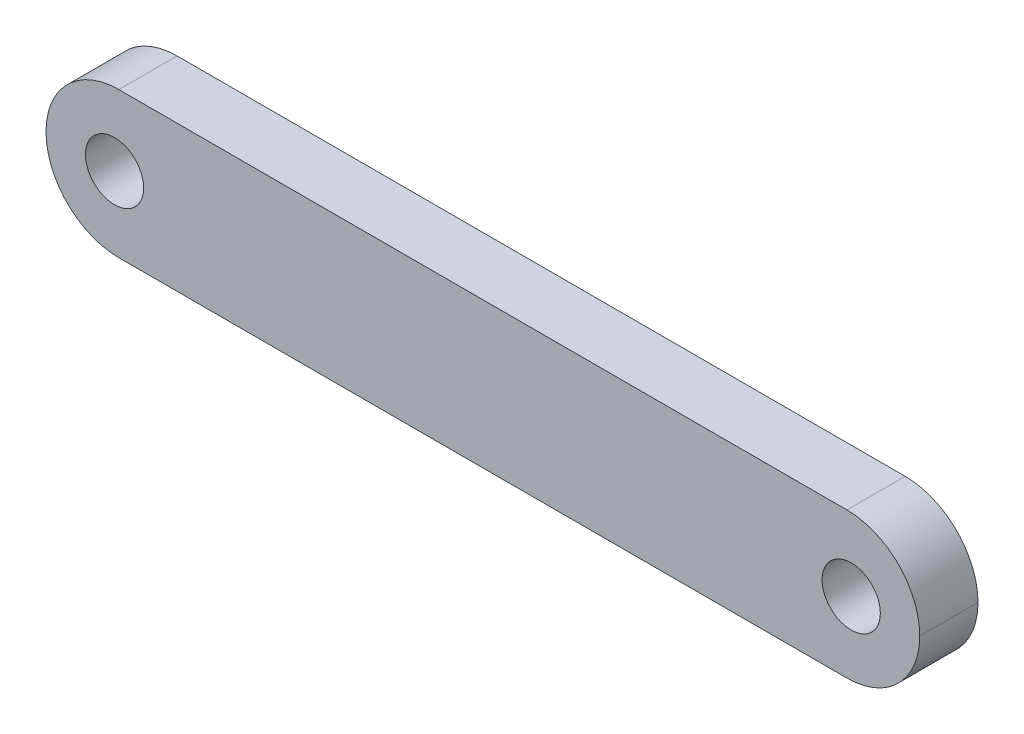
ISO-10303-21;
HEADER;
FILE_DESCRIPTION(('STEP AP214'),'2;1');
FILE_NAME('part.step','',(''),(''),'','','');
FILE_SCHEMA(('AUTOMOTIVE_DESIGN { 1 0 10303 214 1 1 1 1 }'));
ENDSEC;
DATA;
#1=APPLICATION_CONTEXT('core data for automotive mechanical design processes');
#2=APPLICATION_PROTOCOL_DEFINITION('international standard','automotive_design',2000,#1);
#3=PRODUCT_CONTEXT('',#1,'mechanical');
#4=PRODUCT('Part','Part','',(#3));
#5=PRODUCT_RELATED_PRODUCT_CATEGORY('part','',(#4));
#6=PRODUCT_DEFINITION_FORMATION('','',#4);
#7=PRODUCT_DEFINITION_CONTEXT('part definition',#1,'design');
#8=PRODUCT_DEFINITION('design','',#6,#7);
#9=PRODUCT_DEFINITION_SHAPE('','',#8);
#10=(LENGTH_UNIT() NAMED_UNIT(*) SI_UNIT(.MILLI.,.METRE.));
#11=(NAMED_UNIT(*) PLANE_ANGLE_UNIT() SI_UNIT($,.RADIAN.));
#12=(NAMED_UNIT(*) SI_UNIT($,.STERADIAN.) SOLID_ANGLE_UNIT());
#13=UNCERTAINTY_MEASURE_WITH_UNIT(LENGTH_MEASURE(1.E-05),#10,'distance_accuracy_value','');
#14=(GEOMETRIC_REPRESENTATION_CONTEXT(3) GLOBAL_UNCERTAINTY_ASSIGNED_CONTEXT((#13)) GLOBAL_UNIT_ASSIGNED_CONTEXT((#10,
#11,#12)) REPRESENTATION_CONTEXT('',''));
#15=CARTESIAN_POINT('',(0.,0.,0.));
#16=DIRECTION('',(0.,0.,1.));
#17=DIRECTION('',(1.,0.,0.));
#18=AXIS2_PLACEMENT_3D('',#15,#16,#17);
#19=CARTESIAN_POINT('',(0.,0.,2.));
#20=DIRECTION('',(0.,0.,1.));
#21=DIRECTION('',(1.,0.,0.));
#22=AXIS2_PLACEMENT_3D('',#19,#20,#21);
#23=PLANE('',#22);
#24=CARTESIAN_POINT('',(12.6461263558895,0.,2.));
#25=DIRECTION('',(0.,0.,1.));
#26=DIRECTION('',(1.,0.,0.));
#27=AXIS2_PLACEMENT_3D('',#24,#25,#26);
#28=CIRCLE('',#27,1.);
#29=CARTESIAN_POINT('',(13.6461263558895,0.,2.));
#30=VERTEX_POINT('',#29);
#31=EDGE_CURVE('E126',#30,#30,#28,.T.);
#32=ORIENTED_EDGE('',*,*,#31,.F.);
#33=EDGE_LOOP('',(#32));
#34=FACE_BOUND('',#33,.T.);
#35=CARTESIAN_POINT('',(-12.5,0.,2.));
#36=DIRECTION('',(0.,0.,1.));
#37=DIRECTION('',(1.,0.,0.));
#38=AXIS2_PLACEMENT_3D('',#35,#36,#37);
#39=CIRCLE('',#38,2.5);
#40=CARTESIAN_POINT('',(-12.5,2.5,2.));
#41=VERTEX_POINT('',#40);
#42=CARTESIAN_POINT('',(-15.,0.,2.));
#43=VERTEX_POINT('',#42);
#44=EDGE_CURVE('E56',#41,#43,#39,.T.);
#45=ORIENTED_EDGE('',*,*,#44,.T.);
#46=CARTESIAN_POINT('',(-12.5,0.,2.));
#47=DIRECTION('',(0.,0.,1.));
#48=DIRECTION('',(1.,0.,0.));
#49=AXIS2_PLACEMENT_3D('',#46,#47,#48);
#50=CIRCLE('',#49,2.5);
#51=CARTESIAN_POINT('',(-12.5,-2.5,2.));
#52=VERTEX_POINT('',#51);
#53=EDGE_CURVE('E138',#43,#52,#50,.T.);
#54=ORIENTED_EDGE('',*,*,#53,.T.);
#55=DIRECTION('',(1.,0.,0.));
#56=VECTOR('',#55,1.);
#57=CARTESIAN_POINT('',(-15.,-2.5,2.));
#58=LINE('',#57,#56);
#59=CARTESIAN_POINT('',(12.5,-2.5,2.));
#60=VERTEX_POINT('',#59);
#61=EDGE_CURVE('E114',#52,#60,#58,.T.);
#62=ORIENTED_EDGE('',*,*,#61,.T.);
#63=CARTESIAN_POINT('',(12.5,0.,2.));
#64=DIRECTION('',(0.,0.,1.));
#65=DIRECTION('',(1.,0.,0.));
#66=AXIS2_PLACEMENT_3D('',#63,#64,#65);
#67=CIRCLE('',#66,2.5);
#68=CARTESIAN_POINT('',(15.,0.,2.));
#69=VERTEX_POINT('',#68);
#70=EDGE_CURVE('E135',#60,#69,#67,.T.);
#71=ORIENTED_EDGE('',*,*,#70,.T.);
#72=CARTESIAN_POINT('',(12.5,0.,2.));
#73=DIRECTION('',(0.,0.,1.));
#74=DIRECTION('',(1.,0.,0.));
#75=AXIS2_PLACEMENT_3D('',#72,#73,#74);
#76=CIRCLE('',#75,2.5);
#77=CARTESIAN_POINT('',(12.5,2.5,2.));
#78=VERTEX_POINT('',#77);
#79=EDGE_CURVE('E103',#69,#78,#76,.T.);
#80=ORIENTED_EDGE('',*,*,#79,.T.);
#81=DIRECTION('',(-1.,0.,0.));
#82=VECTOR('',#81,1.);
#83=CARTESIAN_POINT('',(-15.,2.5,2.));
#84=LINE('',#83,#82);
#85=EDGE_CURVE('E122',#78,#41,#84,.T.);
#86=ORIENTED_EDGE('',*,*,#85,.T.);
#87=EDGE_LOOP('',(#45,#54,#62,#71,#80,#86));
#88=FACE_BOUND('',#87,.T.);
#89=CARTESIAN_POINT('',(-12.6461263558895,0.,2.));
#90=DIRECTION('',(0.,0.,1.));
#91=DIRECTION('',(-1.,0.,0.));
#92=AXIS2_PLACEMENT_3D('',#89,#90,#91);
#93=CIRCLE('',#92,1.);
#94=CARTESIAN_POINT('',(-13.6461263558895,0.,2.));
#95=VERTEX_POINT('',#94);
#96=EDGE_CURVE('E142',#95,#95,#93,.T.);
#97=ORIENTED_EDGE('',*,*,#96,.F.);
#98=EDGE_LOOP('',(#97));
#99=FACE_BOUND('',#98,.T.);
#100=ADVANCED_FACE('F39',(#34,#88,#99),#23,.T.);
#101=CARTESIAN_POINT('',(0.,0.,0.));
#102=DIRECTION('',(0.,0.,1.));
#103=DIRECTION('',(1.,0.,0.));
#104=AXIS2_PLACEMENT_3D('',#101,#102,#103);
#105=PLANE('',#104);
#106=DIRECTION('',(1.,0.,0.));
#107=VECTOR('',#106,1.);
#108=CARTESIAN_POINT('',(-15.,-2.5,0.));
#109=LINE('',#108,#107);
#110=CARTESIAN_POINT('',(-12.5,-2.5,0.));
#111=VERTEX_POINT('',#110);
#112=CARTESIAN_POINT('',(12.5,-2.5,0.));
#113=VERTEX_POINT('',#112);
#114=EDGE_CURVE('E111',#111,#113,#109,.T.);
#115=ORIENTED_EDGE('',*,*,#114,.F.);
#116=CARTESIAN_POINT('',(-12.5,0.,0.));
#117=DIRECTION('',(0.,0.,1.));
#118=DIRECTION('',(1.,0.,0.));
#119=AXIS2_PLACEMENT_3D('',#116,#117,#118);
#120=CIRCLE('',#119,2.5);
#121=CARTESIAN_POINT('',(-15.,0.,0.));
#122=VERTEX_POINT('',#121);
#123=EDGE_CURVE('E94',#111,#122,#120,.F.);
#124=ORIENTED_EDGE('',*,*,#123,.T.);
#125=CARTESIAN_POINT('',(-12.5,0.,0.));
#126=DIRECTION('',(0.,0.,1.));
#127=DIRECTION('',(1.,0.,0.));
#128=AXIS2_PLACEMENT_3D('',#125,#126,#127);
#129=CIRCLE('',#128,2.5);
#130=CARTESIAN_POINT('',(-12.5,2.5,0.));
#131=VERTEX_POINT('',#130);
#132=EDGE_CURVE('E104',#122,#131,#129,.F.);
#133=ORIENTED_EDGE('',*,*,#132,.T.);
#134=DIRECTION('',(-1.,0.,0.));
#135=VECTOR('',#134,1.);
#136=CARTESIAN_POINT('',(-15.,2.5,0.));
#137=LINE('',#136,#135);
#138=CARTESIAN_POINT('',(12.5,2.5,0.));
#139=VERTEX_POINT('',#138);
#140=EDGE_CURVE('E123',#139,#131,#137,.T.);
#141=ORIENTED_EDGE('',*,*,#140,.F.);
#142=CARTESIAN_POINT('',(12.5,0.,0.));
#143=DIRECTION('',(0.,0.,1.));
#144=DIRECTION('',(1.,0.,0.));
#145=AXIS2_PLACEMENT_3D('',#142,#143,#144);
#146=CIRCLE('',#145,2.5);
#147=CARTESIAN_POINT('',(15.,0.,0.));
#148=VERTEX_POINT('',#147);
#149=EDGE_CURVE('E115',#139,#148,#146,.F.);
#150=ORIENTED_EDGE('',*,*,#149,.T.);
#151=CARTESIAN_POINT('',(12.5,0.,0.));
#152=DIRECTION('',(0.,0.,1.));
#153=DIRECTION('',(1.,0.,0.));
#154=AXIS2_PLACEMENT_3D('',#151,#152,#153);
#155=CIRCLE('',#154,2.5);
#156=EDGE_CURVE('E121',#148,#113,#155,.F.);
#157=ORIENTED_EDGE('',*,*,#156,.T.);
#158=EDGE_LOOP('',(#115,#124,#133,#141,#150,#157));
#159=FACE_BOUND('',#158,.T.);
#160=CARTESIAN_POINT('',(12.6461263558895,0.,0.));
#161=DIRECTION('',(0.,0.,1.));
#162=DIRECTION('',(1.,0.,0.));
#163=AXIS2_PLACEMENT_3D('',#160,#161,#162);
#164=CIRCLE('',#163,1.);
#165=CARTESIAN_POINT('',(13.6461263558895,0.,0.));
#166=VERTEX_POINT('',#165);
#167=EDGE_CURVE('E158',#166,#166,#164,.T.);
#168=ORIENTED_EDGE('',*,*,#167,.T.);
#169=EDGE_LOOP('',(#168));
#170=FACE_BOUND('',#169,.T.);
#171=CARTESIAN_POINT('',(-12.6461263558895,0.,0.));
#172=DIRECTION('',(0.,0.,1.));
#173=DIRECTION('',(-1.,0.,0.));
#174=AXIS2_PLACEMENT_3D('',#171,#172,#173);
#175=CIRCLE('',#174,1.);
#176=CARTESIAN_POINT('',(-13.6461263558895,0.,0.));
#177=VERTEX_POINT('',#176);
#178=EDGE_CURVE('E140',#177,#177,#175,.T.);
#179=ORIENTED_EDGE('',*,*,#178,.T.);
#180=EDGE_LOOP('',(#179));
#181=FACE_BOUND('',#180,.T.);
#182=ADVANCED_FACE('F118',(#159,#170,#181),#105,.F.);
#183=CARTESIAN_POINT('',(-15.,2.5,2.));
#184=DIRECTION('',(0.,-1.,0.));
#185=DIRECTION('',(0.,0.,-1.));
#186=AXIS2_PLACEMENT_3D('',#183,#184,#185);
#187=PLANE('',#186);
#188=ORIENTED_EDGE('',*,*,#140,.T.);
#189=DIRECTION('',(0.,0.,-1.));
#190=VECTOR('',#189,1.);
#191=CARTESIAN_POINT('',(-12.5,2.5,2.));
#192=LINE('',#191,#190);
#193=EDGE_CURVE('E11',#131,#41,#192,.F.);
#194=ORIENTED_EDGE('',*,*,#193,.T.);
#195=ORIENTED_EDGE('',*,*,#85,.F.);
#196=DIRECTION('',(0.,0.,-1.));
#197=VECTOR('',#196,1.);
#198=CARTESIAN_POINT('',(12.5,2.5,2.));
#199=LINE('',#198,#197);
#200=EDGE_CURVE('E48',#78,#139,#199,.T.);
#201=ORIENTED_EDGE('',*,*,#200,.T.);
#202=EDGE_LOOP('',(#188,#194,#195,#201));
#203=FACE_BOUND('',#202,.T.);
#204=ADVANCED_FACE('F153',(#203),#187,.F.);
#205=CARTESIAN_POINT('',(-15.,-2.5,2.));
#206=DIRECTION('',(0.,1.,0.));
#207=DIRECTION('',(0.,0.,1.));
#208=AXIS2_PLACEMENT_3D('',#205,#206,#207);
#209=PLANE('',#208);
#210=ORIENTED_EDGE('',*,*,#61,.F.);
#211=DIRECTION('',(0.,0.,-1.));
#212=VECTOR('',#211,1.);
#213=CARTESIAN_POINT('',(-12.5,-2.5,2.));
#214=LINE('',#213,#212);
#215=EDGE_CURVE('E98',#52,#111,#214,.T.);
#216=ORIENTED_EDGE('',*,*,#215,.T.);
#217=ORIENTED_EDGE('',*,*,#114,.T.);
#218=DIRECTION('',(0.,0.,-1.));
#219=VECTOR('',#218,1.);
#220=CARTESIAN_POINT('',(12.5,-2.5,2.));
#221=LINE('',#220,#219);
#222=EDGE_CURVE('E116',#113,#60,#221,.F.);
#223=ORIENTED_EDGE('',*,*,#222,.T.);
#224=EDGE_LOOP('',(#210,#216,#217,#223));
#225=FACE_BOUND('',#224,.T.);
#226=ADVANCED_FACE('F109',(#225),#209,.F.);
#227=CARTESIAN_POINT('',(12.6461263558895,0.,2.));
#228=DIRECTION('',(0.,0.,-1.));
#229=DIRECTION('',(-1.,0.,0.));
#230=AXIS2_PLACEMENT_3D('',#227,#228,#229);
#231=CYLINDRICAL_SURFACE('',#230,1.);
#232=ORIENTED_EDGE('',*,*,#31,.T.);
#233=EDGE_LOOP('',(#232));
#234=FACE_BOUND('',#233,.T.);
#235=ORIENTED_EDGE('',*,*,#167,.F.);
#236=EDGE_LOOP('',(#235));
#237=FACE_BOUND('',#236,.T.);
#238=ADVANCED_FACE('F178',(#234,#237),#231,.F.);
#239=CARTESIAN_POINT('',(-12.6461263558895,0.,2.));
#240=DIRECTION('',(0.,0.,-1.));
#241=DIRECTION('',(-1.,0.,0.));
#242=AXIS2_PLACEMENT_3D('',#239,#240,#241);
#243=CYLINDRICAL_SURFACE('',#242,1.);
#244=ORIENTED_EDGE('',*,*,#96,.T.);
#245=EDGE_LOOP('',(#244));
#246=FACE_BOUND('',#245,.T.);
#247=ORIENTED_EDGE('',*,*,#178,.F.);
#248=EDGE_LOOP('',(#247));
#249=FACE_BOUND('',#248,.T.);
#250=ADVANCED_FACE('F166',(#246,#249),#243,.F.);
#251=CARTESIAN_POINT('',(-12.5,0.,2.));
#252=DIRECTION('',(0.,0.,-1.));
#253=DIRECTION('',(-1.,0.,0.));
#254=AXIS2_PLACEMENT_3D('',#251,#252,#253);
#255=CYLINDRICAL_SURFACE('',#254,2.5);
#256=DIRECTION('',(0.,0.,-1.));
#257=VECTOR('',#256,1.);
#258=CARTESIAN_POINT('',(-15.,0.,2.));
#259=LINE('',#258,#257);
#260=EDGE_CURVE('E99',#43,#122,#259,.T.);
#261=ORIENTED_EDGE('',*,*,#260,.F.);
#262=ORIENTED_EDGE('',*,*,#44,.F.);
#263=ORIENTED_EDGE('',*,*,#193,.F.);
#264=ORIENTED_EDGE('',*,*,#132,.F.);
#265=EDGE_LOOP('',(#261,#262,#263,#264));
#266=FACE_BOUND('',#265,.T.);
#267=ADVANCED_FACE('F156',(#266),#255,.T.);
#268=CARTESIAN_POINT('',(-12.5,0.,2.));
#269=DIRECTION('',(0.,0.,-1.));
#270=DIRECTION('',(-1.,0.,0.));
#271=AXIS2_PLACEMENT_3D('',#268,#269,#270);
#272=CYLINDRICAL_SURFACE('',#271,2.5);
#273=ORIENTED_EDGE('',*,*,#53,.F.);
#274=ORIENTED_EDGE('',*,*,#260,.T.);
#275=ORIENTED_EDGE('',*,*,#123,.F.);
#276=ORIENTED_EDGE('',*,*,#215,.F.);
#277=EDGE_LOOP('',(#273,#274,#275,#276));
#278=FACE_BOUND('',#277,.T.);
#279=ADVANCED_FACE('F97',(#278),#272,.T.);
#280=CARTESIAN_POINT('',(12.5,0.,2.));
#281=DIRECTION('',(0.,0.,-1.));
#282=DIRECTION('',(-1.,0.,0.));
#283=AXIS2_PLACEMENT_3D('',#280,#281,#282);
#284=CYLINDRICAL_SURFACE('',#283,2.5);
#285=ORIENTED_EDGE('',*,*,#200,.F.);
#286=ORIENTED_EDGE('',*,*,#79,.F.);
#287=DIRECTION('',(0.,0.,-1.));
#288=VECTOR('',#287,1.);
#289=CARTESIAN_POINT('',(15.,0.,2.));
#290=LINE('',#289,#288);
#291=EDGE_CURVE('E43',#148,#69,#290,.F.);
#292=ORIENTED_EDGE('',*,*,#291,.F.);
#293=ORIENTED_EDGE('',*,*,#149,.F.);
#294=EDGE_LOOP('',(#285,#286,#292,#293));
#295=FACE_BOUND('',#294,.T.);
#296=ADVANCED_FACE('F41',(#295),#284,.T.);
#297=CARTESIAN_POINT('',(12.5,0.,2.));
#298=DIRECTION('',(0.,0.,-1.));
#299=DIRECTION('',(-1.,0.,0.));
#300=AXIS2_PLACEMENT_3D('',#297,#298,#299);
#301=CYLINDRICAL_SURFACE('',#300,2.5);
#302=ORIENTED_EDGE('',*,*,#70,.F.);
#303=ORIENTED_EDGE('',*,*,#222,.F.);
#304=ORIENTED_EDGE('',*,*,#156,.F.);
#305=ORIENTED_EDGE('',*,*,#291,.T.);
#306=EDGE_LOOP('',(#302,#303,#304,#305));
#307=FACE_BOUND('',#306,.T.);
#308=ADVANCED_FACE('F147',(#307),#301,.T.);
#309=CLOSED_SHELL('',(#100,#182,#204,#226,#238,#250,#267,#279,#296,#308));
#310=MANIFOLD_SOLID_BREP('B2',#309);
#311=ADVANCED_BREP_SHAPE_REPRESENTATION('',(#18,#310),#14);
#312=SHAPE_DEFINITION_REPRESENTATION(#9,#311);
ENDSEC;
END-ISO-10303-21;
